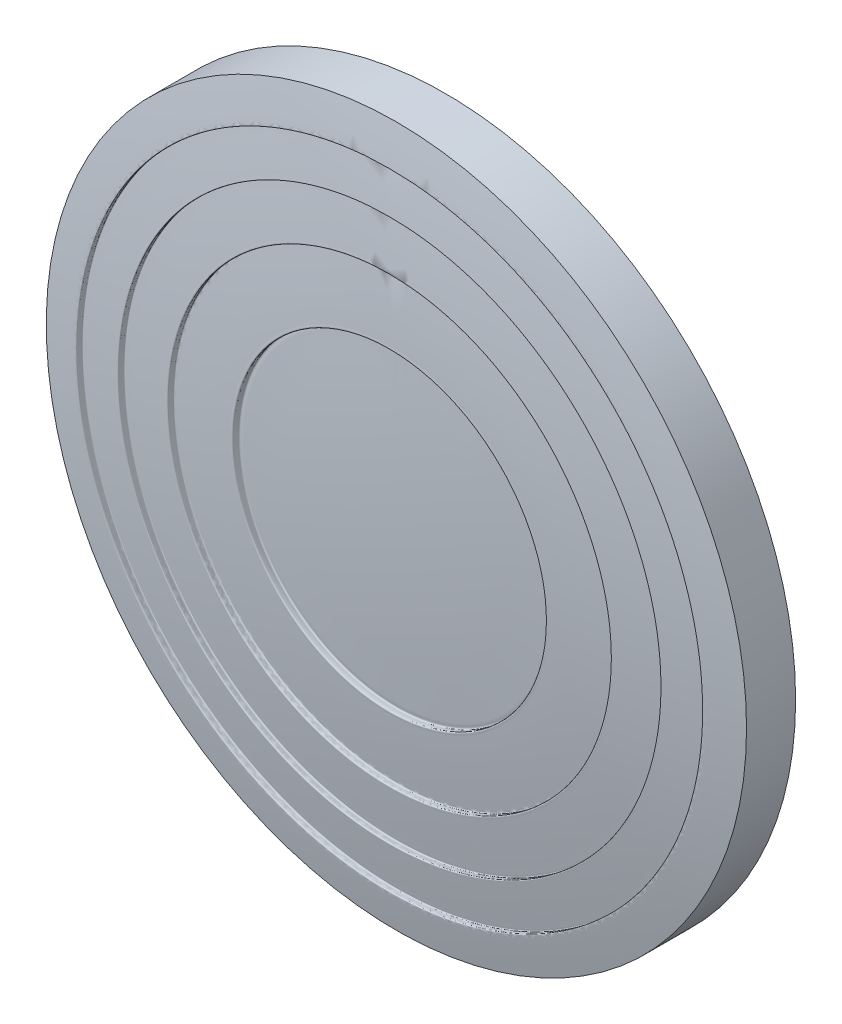
ISO-10303-21;
HEADER;
FILE_DESCRIPTION(('STEP AP214'),'2;1');
FILE_NAME('part.step','',(''),(''),'','','');
FILE_SCHEMA(('AUTOMOTIVE_DESIGN { 1 0 10303 214 1 1 1 1 }'));
ENDSEC;
DATA;
#1=APPLICATION_CONTEXT('core data for automotive mechanical design processes');
#2=APPLICATION_PROTOCOL_DEFINITION('international standard','automotive_design',2000,#1);
#3=PRODUCT_CONTEXT('',#1,'mechanical');
#4=PRODUCT('Part','Part','',(#3));
#5=PRODUCT_RELATED_PRODUCT_CATEGORY('part','',(#4));
#6=PRODUCT_DEFINITION_FORMATION('','',#4);
#7=PRODUCT_DEFINITION_CONTEXT('part definition',#1,'design');
#8=PRODUCT_DEFINITION('design','',#6,#7);
#9=PRODUCT_DEFINITION_SHAPE('','',#8);
#10=(LENGTH_UNIT() NAMED_UNIT(*) SI_UNIT(.MILLI.,.METRE.));
#11=(NAMED_UNIT(*) PLANE_ANGLE_UNIT() SI_UNIT($,.RADIAN.));
#12=(NAMED_UNIT(*) SI_UNIT($,.STERADIAN.) SOLID_ANGLE_UNIT());
#13=UNCERTAINTY_MEASURE_WITH_UNIT(LENGTH_MEASURE(1.E-05),#10,'distance_accuracy_value','');
#14=(GEOMETRIC_REPRESENTATION_CONTEXT(3) GLOBAL_UNCERTAINTY_ASSIGNED_CONTEXT((#13)) GLOBAL_UNIT_ASSIGNED_CONTEXT((#10,
#11,#12)) REPRESENTATION_CONTEXT('',''));
#15=CARTESIAN_POINT('',(0.,0.,0.));
#16=DIRECTION('',(0.,0.,1.));
#17=DIRECTION('',(1.,0.,0.));
#18=AXIS2_PLACEMENT_3D('',#15,#16,#17);
#19=CARTESIAN_POINT('',(0.,5.,0.));
#20=CARTESIAN_POINT('',(0.,4.99289497907944,0.00144938128956088));
#21=CARTESIAN_POINT('',(0.,4.97868417468913,0.00434447903613767));
#22=CARTESIAN_POINT('',(0.,4.89695698332903,0.0209156945038849));
#23=CARTESIAN_POINT('',(0.,4.77958151674729,0.044163632192735));
#24=CARTESIAN_POINT('',(0.,4.64782555409376,0.0693189673170852));
#25=CARTESIAN_POINT('',(0.,4.57297124871869,0.0833254491827367));
#26=CARTESIAN_POINT('',(0.,4.53733021016122,0.0899054030109482));
#27=CARTESIAN_POINT('',(0.,4.51949072968036,0.0931990992578937));
#28=CARTESIAN_POINT('',(0.,4.5088160340184,0.0951349394930897));
#29=CARTESIAN_POINT('',(0.,4.49802910336661,0.0971994848044371));
#30=CARTESIAN_POINT('',(0.,4.48765699196565,0.0987616214211113));
#31=CARTESIAN_POINT('',(0.,4.44279189248601,0.111611208546808));
#32=CARTESIAN_POINT('',(0.,4.51075429629283,-0.0112471969462517));
#33=CARTESIAN_POINT('',(0.,4.46423337491825,0.00260200049667422));
#34=CARTESIAN_POINT('',(0.,4.45251581709714,0.00430007955590743));
#35=CARTESIAN_POINT('',(0.,4.44026704479897,0.00662797990302008));
#36=CARTESIAN_POINT('',(0.,4.42815924278038,0.00877954099022495));
#37=CARTESIAN_POINT('',(0.,4.41601229778165,0.0109707572655679));
#38=CARTESIAN_POINT('',(0.,4.40387447473162,0.0131437519901195));
#39=CARTESIAN_POINT('',(0.,4.38363843090177,0.0167608884310964));
#40=CARTESIAN_POINT('',(0.,4.30268482817189,0.0311437969524528));
#41=CARTESIAN_POINT('',(0.,4.18519759195451,0.0514573388740905));
#42=CARTESIAN_POINT('',(0.,4.05948894319254,0.0723456100098767));
#43=CARTESIAN_POINT('',(0.,3.98643480842716,0.0842248623667227));
#44=CARTESIAN_POINT('',(0.,3.94991447741862,0.0900709587985488));
#45=CARTESIAN_POINT('',(0.,3.92960192361953,0.0933224646100527));
#46=CARTESIAN_POINT('',(0.,3.91745104199512,0.0952234184873793));
#47=CARTESIAN_POINT('',(0.,3.90515885875114,0.0972823597744563));
#48=CARTESIAN_POINT('',(0.,3.89338952495365,0.098723242098094));
#49=CARTESIAN_POINT('',(0.,3.8467660661939,0.111356708588465));
#50=CARTESIAN_POINT('',(0.,3.91523489664139,-0.0113666893917956));
#51=CARTESIAN_POINT('',(0.,3.86599029185931,0.00279473754022775));
#52=CARTESIAN_POINT('',(0.,3.85212369672667,0.00438026620118644));
#53=CARTESIAN_POINT('',(0.,3.83752931368565,0.00680755887383738));
#54=CARTESIAN_POINT('',(0.,3.82312827566713,0.00899858039840469));
#55=CARTESIAN_POINT('',(0.,3.80867377159299,0.0112422152433243));
#56=CARTESIAN_POINT('',(0.,3.78941800180611,0.0142006533631332));
#57=CARTESIAN_POINT('',(0.,3.76533862181014,0.0178851291666862));
#58=CARTESIAN_POINT('',(0.,3.66901011803732,0.0325030656259182));
#59=CARTESIAN_POINT('',(0.,3.53403713235742,0.0522653205428465));
#60=CARTESIAN_POINT('',(0.,3.3748088408283,0.0743262261015582));
#61=CARTESIAN_POINT('',(0.,3.28787930630019,0.0859491359924197));
#62=CARTESIAN_POINT('',(0.,3.24441622720126,0.0916420137472321));
#63=CARTESIAN_POINT('',(0.,3.2299137705995,0.0935466398538565));
#64=CARTESIAN_POINT('',(0.,3.21546115507232,0.0953849688314134));
#65=CARTESIAN_POINT('',(0.,3.20081730818511,0.097430662251278));
#66=CARTESIAN_POINT('',(0.,3.18688196530133,0.0986623805761286));
#67=CARTESIAN_POINT('',(0.,3.13761307756154,0.111226787034477));
#68=CARTESIAN_POINT('',(0.,3.20675265786233,-0.0122053480365395));
#69=CARTESIAN_POINT('',(0.,3.15233981243773,0.0032403180731029));
#70=CARTESIAN_POINT('',(0.,3.1343908661515,0.00457912747101645));
#71=CARTESIAN_POINT('',(0.,3.11526499395942,0.00723963077512243));
#72=CARTESIAN_POINT('',(0.,3.09645218842935,0.00952776803795866));
#73=CARTESIAN_POINT('',(0.,3.07755322012473,0.0118974585810547));
#74=CARTESIAN_POINT('',(0.,3.05867507528599,0.0142270771161256));
#75=CARTESIAN_POINT('',(0.,3.03349377595921,0.0173232578947496));
#76=CARTESIAN_POINT('',(0.,2.9768322241326,0.024220104767733));
#77=CARTESIAN_POINT('',(0.,2.83197761935638,0.0414039550182853));
#78=CARTESIAN_POINT('',(0.,2.64915492781659,0.0616218892922846));
#79=CARTESIAN_POINT('',(0.,2.47249562754725,0.079573486321344));
#80=CARTESIAN_POINT('',(0.,2.38410286040631,0.0881341793543435));
#81=CARTESIAN_POINT('',(0.,2.33991365240646,0.092295247461664));
#82=CARTESIAN_POINT('',(0.,2.32095363717244,0.0940864965375896));
#83=CARTESIAN_POINT('',(0.,2.30206852879301,0.0957799654685166));
#84=CARTESIAN_POINT('',(0.,2.28289751144278,0.0977701031861223));
#85=CARTESIAN_POINT('',(0.,2.26478720982847,0.0985848231406204));
#86=CARTESIAN_POINT('',(0.,2.21100177877112,0.111091676503919));
#87=CARTESIAN_POINT('',(0.,2.28247153206865,-0.0224119443786845));
#88=CARTESIAN_POINT('',(0.,2.19610455095936,0.00778718614325369));
#89=CARTESIAN_POINT('',(0.,2.15467474739922,0.00709727836295561));
#90=CARTESIAN_POINT('',(0.,2.1078137261864,0.0122633189840737));
#91=CARTESIAN_POINT('',(0.,2.06239894992715,0.0157538672748103));
#92=CARTESIAN_POINT('',(0.,2.01658780516542,0.0195869726101447));
#93=CARTESIAN_POINT('',(0.,1.97087421277786,0.0232218803732776));
#94=CARTESIAN_POINT('',(0.,1.9251260231821,0.0268034475157488));
#95=CARTESIAN_POINT('',(0.,1.86412978119925,0.0314560095120262));
#96=CARTESIAN_POINT('',(0.,1.72685436411606,0.0415522167352588));
#97=CARTESIAN_POINT('',(0.,1.3758561534872,0.0647784551388132));
#98=CARTESIAN_POINT('',(0.,0.902218870129245,0.0869504619821898));
#99=CARTESIAN_POINT('',(0.,0.428222335085818,0.0982799148284539));
#100=CARTESIAN_POINT('',(0.,0.168232704188539,0.100646654095751));
#101=CARTESIAN_POINT('',(0.,0.0458817572766904,0.10099620642025));
#102=CARTESIAN_POINT('',(0.,0.015293918586934,0.101012408807018));
#103=CARTESIAN_POINT('',(0.,0.,0.10102051));
#104=B_SPLINE_CURVE_WITH_KNOTS('',3,(#19,#20,#21,#22,#23,#24,#25,#26,#27,#28,#29,#30,#31,#32,
#33,#34,#35,#36,#37,#38,#39,#40,#41,#42,#43,#44,#45,#46,#47,#48,#49,#50,#51,#52,#53,#54,#55,#56,
#57,#58,#59,#60,#61,#62,#63,#64,#65,#66,#67,#68,#69,#70,#71,#72,#73,#74,#75,#76,#77,#78,#79,#80,
#81,#82,#83,#84,#85,#86,#87,#88,#89,#90,#91,#92,#93,#94,#95,#96,#97,#98,#99,#100,#101,#102,
#103),.UNSPECIFIED.,.F.,.F.,(4,1,1,1,1,1,1,1,1,1,1,1,1,1,1,1,1,1,1,1,1,1,1,1,1,1,1,1,1,1,1,1,1,
1,1,1,1,1,1,1,1,1,1,1,1,1,1,1,1,1,1,1,1,1,1,1,1,1,1,1,1,1,1,1,1,1,1,1,1,1,1,1,1,1,1,1,1,1,1,1,1,
1,4),(0.,0.00400035322383163,0.00800070867146363,0.0460040735679385,0.0700061998454002,
0.0820072619257737,0.0880077939683696,0.0900079709209833,0.092008147022027,0.0940083241268349,
0.0960085011365447,0.0980086780992456,0.116585353034113,0.11885333875925,0.121121324993571,
0.123389310480177,0.125657296097594,0.127925282071127,0.130193268953138,0.132461255485763,
0.139265213076099,0.175552986682488,0.198232845689586,0.209572775249301,0.21637673250021,
0.218644719665926,0.22091270563863,0.223180690970328,0.225448676213026,0.227716661632819,
0.246293336567687,0.248980841908601,0.251668345213363,0.254355849216887,0.257043354555652,
0.259730856978621,0.262418362855583,0.267793370189067,0.27316837943514,0.316168445226323,
0.343043486935936,0.361856016716417,0.364543519263596,0.367231023653783,0.369918529221061,
0.372606033236218,0.37529353638197,0.377981039811928,0.396557714746796,0.40005654634363,
0.403555378492814,0.407054209803351,0.410553040246774,0.41405187185015,0.417550702990547,
0.42104953386917,0.428047197247186,0.449040184790652,0.501522654517545,0.529513303536687,
0.547007460568616,0.550506292488554,0.554005123553363,0.557503953786488,0.561002785214952,
0.564501618034496,0.568000448611815,0.586577123546683,0.595014324225573,0.603451527188041,
0.611888727397075,0.62032592929948,0.628763131992733,0.63720033243459,0.645637534922374,
0.654074736708758,0.670949139021313,0.721572347472761,0.848130371771684,0.932502386706085,
0.983125597273113,0.991562799054692,1.),.UNSPECIFIED.);
#105=CARTESIAN_POINT('',(0.,0.,0.290264711137798));
#106=DIRECTION('',(0.,0.,1.));
#107=AXIS1_PLACEMENT('',#105,#106);
#108=SURFACE_OF_REVOLUTION('',#104,#107);
#109=CARTESIAN_POINT('',(0.,0.,0.10102051));
#110=VERTEX_POINT('',#109);
#111=VERTEX_LOOP('',#110);
#112=FACE_BOUND('',#111,.T.);
#113=CARTESIAN_POINT('',(0.,0.,0.));
#114=DIRECTION('',(0.,0.,1.));
#115=DIRECTION('',(1.,0.,0.));
#116=AXIS2_PLACEMENT_3D('',#113,#114,#115);
#117=CIRCLE('',#116,5.);
#118=CARTESIAN_POINT('',(5.,0.,0.));
#119=VERTEX_POINT('',#118);
#120=EDGE_CURVE('E46',#119,#119,#117,.T.);
#121=ORIENTED_EDGE('',*,*,#120,.T.);
#122=EDGE_LOOP('',(#121));
#123=FACE_BOUND('',#122,.T.);
#124=ADVANCED_FACE('F39',(#112,#123),#108,.T.);
#125=CARTESIAN_POINT('',(0.,5.,-0.701015432412364));
#126=DIRECTION('',(0.,0.,1.));
#127=DIRECTION('',(1.,0.,0.));
#128=AXIS2_PLACEMENT_3D('',#125,#126,#127);
#129=PLANE('',#128);
#130=CARTESIAN_POINT('',(0.,0.,-0.701015432412364));
#131=DIRECTION('',(0.,0.,1.));
#132=DIRECTION('',(1.,0.,0.));
#133=AXIS2_PLACEMENT_3D('',#130,#131,#132);
#134=CIRCLE('',#133,5.);
#135=CARTESIAN_POINT('',(5.,0.,-0.701015432412364));
#136=VERTEX_POINT('',#135);
#137=EDGE_CURVE('E11',#136,#136,#134,.T.);
#138=ORIENTED_EDGE('',*,*,#137,.F.);
#139=EDGE_LOOP('',(#138));
#140=FACE_BOUND('',#139,.T.);
#141=ADVANCED_FACE('F51',(#140),#129,.F.);
#142=CARTESIAN_POINT('',(0.,0.,0.290264711137798));
#143=DIRECTION('',(0.,0.,1.));
#144=DIRECTION('',(1.,0.,0.));
#145=AXIS2_PLACEMENT_3D('',#142,#143,#144);
#146=CYLINDRICAL_SURFACE('',#145,5.);
#147=ORIENTED_EDGE('',*,*,#120,.F.);
#148=EDGE_LOOP('',(#147));
#149=FACE_BOUND('',#148,.T.);
#150=ORIENTED_EDGE('',*,*,#137,.T.);
#151=EDGE_LOOP('',(#150));
#152=FACE_BOUND('',#151,.T.);
#153=ADVANCED_FACE('F61',(#149,#152),#146,.T.);
#154=CLOSED_SHELL('',(#124,#141,#153));
#155=MANIFOLD_SOLID_BREP('B2',#154);
#156=ADVANCED_BREP_SHAPE_REPRESENTATION('',(#18,#155),#14);
#157=SHAPE_DEFINITION_REPRESENTATION(#9,#156);
ENDSEC;
END-ISO-10303-21;
